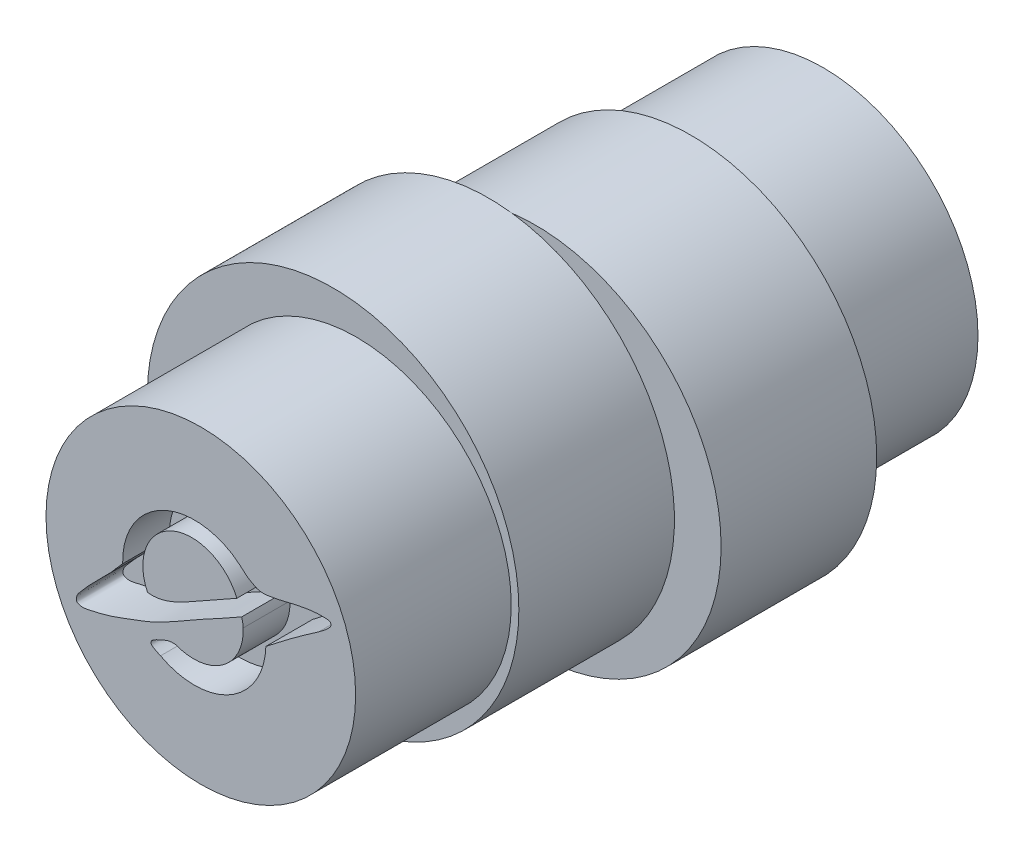
ISO-10303-21;
HEADER;
FILE_DESCRIPTION(('STEP AP214'),'2;1');
FILE_NAME('part.step','',(''),(''),'','','');
FILE_SCHEMA(('AUTOMOTIVE_DESIGN { 1 0 10303 214 1 1 1 1 }'));
ENDSEC;
DATA;
#1=APPLICATION_CONTEXT('core data for automotive mechanical design processes');
#2=APPLICATION_PROTOCOL_DEFINITION('international standard','automotive_design',2000,#1);
#3=PRODUCT_CONTEXT('',#1,'mechanical');
#4=PRODUCT('Part','Part','',(#3));
#5=PRODUCT_RELATED_PRODUCT_CATEGORY('part','',(#4));
#6=PRODUCT_DEFINITION_FORMATION('','',#4);
#7=PRODUCT_DEFINITION_CONTEXT('part definition',#1,'design');
#8=PRODUCT_DEFINITION('design','',#6,#7);
#9=PRODUCT_DEFINITION_SHAPE('','',#8);
#10=(LENGTH_UNIT() NAMED_UNIT(*) SI_UNIT(.MILLI.,.METRE.));
#11=(NAMED_UNIT(*) PLANE_ANGLE_UNIT() SI_UNIT($,.RADIAN.));
#12=(NAMED_UNIT(*) SI_UNIT($,.STERADIAN.) SOLID_ANGLE_UNIT());
#13=UNCERTAINTY_MEASURE_WITH_UNIT(LENGTH_MEASURE(1.E-05),#10,'distance_accuracy_value','');
#14=(GEOMETRIC_REPRESENTATION_CONTEXT(3) GLOBAL_UNCERTAINTY_ASSIGNED_CONTEXT((#13)) GLOBAL_UNIT_ASSIGNED_CONTEXT((#10,
#11,#12)) REPRESENTATION_CONTEXT('',''));
#15=CARTESIAN_POINT('',(0.,0.,0.));
#16=DIRECTION('',(0.,0.,1.));
#17=DIRECTION('',(1.,0.,0.));
#18=AXIS2_PLACEMENT_3D('',#15,#16,#17);
#19=CARTESIAN_POINT('',(2.12717647058824,1.57366968038905,26.1549480894362));
#20=DIRECTION('',(1.,0.,0.));
#21=DIRECTION('',(0.,0.,-1.));
#22=AXIS2_PLACEMENT_3D('',#19,#20,#21);
#23=PLANE('',#22);
#24=DIRECTION('',(0.,1.,0.));
#25=VECTOR('',#24,1.);
#26=CARTESIAN_POINT('',(2.12717647058824,1.57366968038905,13.0549480894362));
#27=LINE('',#26,#25);
#28=CARTESIAN_POINT('',(2.12717647058824,-1.57366968038905,13.0549480894362));
#29=VERTEX_POINT('',#28);
#30=CARTESIAN_POINT('',(2.12717647058824,1.57366968038905,13.0549480894362));
#31=VERTEX_POINT('',#30);
#32=EDGE_CURVE('E11',#29,#31,#27,.T.);
#33=ORIENTED_EDGE('',*,*,#32,.F.);
#34=DIRECTION('',(0.,0.,-1.));
#35=VECTOR('',#34,1.);
#36=CARTESIAN_POINT('',(2.12717647058824,-1.57366968038905,26.1549480894362));
#37=LINE('',#36,#35);
#38=CARTESIAN_POINT('',(2.12717647058824,-1.57366968038905,26.1549480894362));
#39=VERTEX_POINT('',#38);
#40=EDGE_CURVE('E355',#39,#29,#37,.T.);
#41=ORIENTED_EDGE('',*,*,#40,.F.);
#42=DIRECTION('',(0.,-1.,0.));
#43=VECTOR('',#42,1.);
#44=CARTESIAN_POINT('',(2.12717647058824,1.57366968038905,26.1549480894362));
#45=LINE('',#44,#43);
#46=CARTESIAN_POINT('',(2.12717647058824,1.57366968038905,26.1549480894362));
#47=VERTEX_POINT('',#46);
#48=EDGE_CURVE('E347',#47,#39,#45,.T.);
#49=ORIENTED_EDGE('',*,*,#48,.F.);
#50=DIRECTION('',(0.,0.,-1.));
#51=VECTOR('',#50,1.);
#52=CARTESIAN_POINT('',(2.12717647058824,1.57366968038905,26.1549480894362));
#53=LINE('',#52,#51);
#54=EDGE_CURVE('E351',#47,#31,#53,.T.);
#55=ORIENTED_EDGE('',*,*,#54,.T.);
#56=EDGE_LOOP('',(#33,#41,#49,#55));
#57=FACE_BOUND('',#56,.T.);
#58=ADVANCED_FACE('F45',(#57),#23,.F.);
#59=CARTESIAN_POINT('',(0.,0.,29.1263730350485));
#60=DIRECTION('',(0.,0.,-1.));
#61=DIRECTION('',(-1.,0.,0.));
#62=AXIS2_PLACEMENT_3D('',#59,#60,#61);
#63=CYLINDRICAL_SURFACE('',#62,4.975);
#64=CARTESIAN_POINT('',(0.,0.,10.0549480894362));
#65=DIRECTION('',(0.,0.,1.));
#66=DIRECTION('',(1.,0.,0.));
#67=AXIS2_PLACEMENT_3D('',#64,#65,#66);
#68=CIRCLE('',#67,4.975);
#69=CARTESIAN_POINT('',(4.975,0.,10.0549480894362));
#70=VERTEX_POINT('',#69);
#71=EDGE_CURVE('E383',#70,#70,#68,.T.);
#72=ORIENTED_EDGE('',*,*,#71,.T.);
#73=EDGE_LOOP('',(#72));
#74=FACE_BOUND('',#73,.T.);
#75=CARTESIAN_POINT('',(0.,0.,15.0549480894362));
#76=DIRECTION('',(0.,0.,1.));
#77=DIRECTION('',(1.,0.,0.));
#78=AXIS2_PLACEMENT_3D('',#75,#76,#77);
#79=CIRCLE('',#78,4.975);
#80=CARTESIAN_POINT('',(4.975,0.,15.0549480894362));
#81=VERTEX_POINT('',#80);
#82=EDGE_CURVE('E388',#81,#81,#79,.T.);
#83=ORIENTED_EDGE('',*,*,#82,.F.);
#84=EDGE_LOOP('',(#83));
#85=FACE_BOUND('',#84,.T.);
#86=ADVANCED_FACE('F47',(#74,#85),#63,.T.);
#87=CARTESIAN_POINT('',(0.,0.,10.0549480894362));
#88=DIRECTION('',(0.,0.,1.));
#89=DIRECTION('',(1.,0.,0.));
#90=AXIS2_PLACEMENT_3D('',#87,#88,#89);
#91=PLANE('',#90);
#92=CARTESIAN_POINT('',(0.,0.,10.0549480894362));
#93=DIRECTION('',(0.,0.,-1.));
#94=DIRECTION('',(-1.,0.,0.));
#95=AXIS2_PLACEMENT_3D('',#92,#93,#94);
#96=CIRCLE('',#95,2.646);
#97=CARTESIAN_POINT('',(-2.646,0.,10.0549480894362));
#98=VERTEX_POINT('',#97);
#99=EDGE_CURVE('E342',#98,#98,#96,.T.);
#100=ORIENTED_EDGE('',*,*,#99,.F.);
#101=EDGE_LOOP('',(#100));
#102=FACE_BOUND('',#101,.T.);
#103=ORIENTED_EDGE('',*,*,#71,.F.);
#104=EDGE_LOOP('',(#103));
#105=FACE_BOUND('',#104,.T.);
#106=ADVANCED_FACE('F397',(#102,#105),#91,.F.);
#107=CARTESIAN_POINT('',(0.75,0.,20.0549480894362));
#108=DIRECTION('',(0.,0.,1.));
#109=DIRECTION('',(1.,0.,0.));
#110=AXIS2_PLACEMENT_3D('',#107,#108,#109);
#111=PLANE('',#110);
#112=CARTESIAN_POINT('',(-0.75,0.,20.0549480894362));
#113=DIRECTION('',(0.,0.,1.));
#114=DIRECTION('',(1.,0.,0.));
#115=AXIS2_PLACEMENT_3D('',#112,#113,#114);
#116=CIRCLE('',#115,5.97);
#117=CARTESIAN_POINT('',(0.,-5.92270208604147,20.0549480894362));
#118=VERTEX_POINT('',#117);
#119=CARTESIAN_POINT('',(0.,5.92270208604147,20.0549480894362));
#120=VERTEX_POINT('',#119);
#121=EDGE_CURVE('E370',#118,#120,#116,.T.);
#122=ORIENTED_EDGE('',*,*,#121,.F.);
#123=CARTESIAN_POINT('',(0.75,0.,20.0549480894362));
#124=DIRECTION('',(0.,0.,1.));
#125=DIRECTION('',(1.,0.,0.));
#126=AXIS2_PLACEMENT_3D('',#123,#124,#125);
#127=CIRCLE('',#126,5.97);
#128=EDGE_CURVE('E384',#118,#120,#127,.T.);
#129=ORIENTED_EDGE('',*,*,#128,.T.);
#130=EDGE_LOOP('',(#122,#129));
#131=FACE_BOUND('',#130,.T.);
#132=ADVANCED_FACE('F399',(#131),#111,.T.);
#133=CARTESIAN_POINT('',(0.75,0.,15.0549480894362));
#134=DIRECTION('',(0.,0.,1.));
#135=DIRECTION('',(1.,0.,0.));
#136=AXIS2_PLACEMENT_3D('',#133,#134,#135);
#137=PLANE('',#136);
#138=ORIENTED_EDGE('',*,*,#82,.T.);
#139=EDGE_LOOP('',(#138));
#140=FACE_BOUND('',#139,.T.);
#141=CARTESIAN_POINT('',(0.75,0.,15.0549480894362));
#142=DIRECTION('',(0.,0.,1.));
#143=DIRECTION('',(1.,0.,0.));
#144=AXIS2_PLACEMENT_3D('',#141,#142,#143);
#145=CIRCLE('',#144,5.97);
#146=CARTESIAN_POINT('',(6.72,0.,15.0549480894362));
#147=VERTEX_POINT('',#146);
#148=EDGE_CURVE('E375',#147,#147,#145,.T.);
#149=ORIENTED_EDGE('',*,*,#148,.F.);
#150=EDGE_LOOP('',(#149));
#151=FACE_BOUND('',#150,.T.);
#152=ADVANCED_FACE('F406',(#140,#151),#137,.F.);
#153=CARTESIAN_POINT('',(0.75,0.,20.0549480894362));
#154=DIRECTION('',(0.,0.,-1.));
#155=DIRECTION('',(-1.,0.,0.));
#156=AXIS2_PLACEMENT_3D('',#153,#154,#155);
#157=CYLINDRICAL_SURFACE('',#156,5.97);
#158=EDGE_CURVE('E379',#120,#118,#127,.T.);
#159=ORIENTED_EDGE('',*,*,#158,.F.);
#160=ORIENTED_EDGE('',*,*,#128,.F.);
#161=EDGE_LOOP('',(#159,#160));
#162=FACE_BOUND('',#161,.T.);
#163=ORIENTED_EDGE('',*,*,#148,.T.);
#164=EDGE_LOOP('',(#163));
#165=FACE_BOUND('',#164,.T.);
#166=ADVANCED_FACE('F442',(#162,#165),#157,.T.);
#167=CARTESIAN_POINT('',(-0.75,0.,20.0549480894362));
#168=DIRECTION('',(0.,0.,1.));
#169=DIRECTION('',(1.,0.,0.));
#170=AXIS2_PLACEMENT_3D('',#167,#168,#169);
#171=PLANE('',#170);
#172=EDGE_CURVE('E366',#120,#118,#116,.T.);
#173=ORIENTED_EDGE('',*,*,#172,.F.);
#174=ORIENTED_EDGE('',*,*,#158,.T.);
#175=EDGE_LOOP('',(#173,#174));
#176=FACE_BOUND('',#175,.T.);
#177=ADVANCED_FACE('F438',(#176),#171,.F.);
#178=CARTESIAN_POINT('',(-0.75,0.,25.0549480894362));
#179=DIRECTION('',(0.,0.,1.));
#180=DIRECTION('',(1.,0.,0.));
#181=AXIS2_PLACEMENT_3D('',#178,#179,#180);
#182=PLANE('',#181);
#183=CARTESIAN_POINT('',(0.,0.,25.0549480894362));
#184=DIRECTION('',(0.,0.,1.));
#185=DIRECTION('',(1.,0.,0.));
#186=AXIS2_PLACEMENT_3D('',#183,#184,#185);
#187=CIRCLE('',#186,4.975);
#188=CARTESIAN_POINT('',(4.975,0.,25.0549480894362));
#189=VERTEX_POINT('',#188);
#190=EDGE_CURVE('E54',#189,#189,#187,.T.);
#191=ORIENTED_EDGE('',*,*,#190,.F.);
#192=EDGE_LOOP('',(#191));
#193=FACE_BOUND('',#192,.T.);
#194=CARTESIAN_POINT('',(-0.75,0.,25.0549480894362));
#195=DIRECTION('',(0.,0.,1.));
#196=DIRECTION('',(1.,0.,0.));
#197=AXIS2_PLACEMENT_3D('',#194,#195,#196);
#198=CIRCLE('',#197,5.97);
#199=CARTESIAN_POINT('',(5.22,0.,25.0549480894362));
#200=VERTEX_POINT('',#199);
#201=EDGE_CURVE('E371',#200,#200,#198,.T.);
#202=ORIENTED_EDGE('',*,*,#201,.T.);
#203=EDGE_LOOP('',(#202));
#204=FACE_BOUND('',#203,.T.);
#205=ADVANCED_FACE('F435',(#193,#204),#182,.T.);
#206=CARTESIAN_POINT('',(-0.75,0.,25.0549480894362));
#207=DIRECTION('',(0.,0.,-1.));
#208=DIRECTION('',(-1.,0.,0.));
#209=AXIS2_PLACEMENT_3D('',#206,#207,#208);
#210=CYLINDRICAL_SURFACE('',#209,5.97);
#211=ORIENTED_EDGE('',*,*,#201,.F.);
#212=EDGE_LOOP('',(#211));
#213=FACE_BOUND('',#212,.T.);
#214=ORIENTED_EDGE('',*,*,#172,.T.);
#215=ORIENTED_EDGE('',*,*,#121,.T.);
#216=EDGE_LOOP('',(#214,#215));
#217=FACE_BOUND('',#216,.T.);
#218=ADVANCED_FACE('F429',(#213,#217),#210,.T.);
#219=CARTESIAN_POINT('',(0.,0.,30.0549480894362));
#220=DIRECTION('',(0.,0.,1.));
#221=DIRECTION('',(1.,0.,0.));
#222=AXIS2_PLACEMENT_3D('',#219,#220,#221);
#223=PLANE('',#222);
#224=CARTESIAN_POINT('',(-2.51116552040536,-0.0879546361955797,30.0549480894362));
#225=CARTESIAN_POINT('',(-2.62882372726046,-0.204972871875267,30.0549480894362));
#226=CARTESIAN_POINT('',(-2.79409231360333,-0.437511253772377,30.0549480894362));
#227=CARTESIAN_POINT('',(-3.09159848005516,-0.713615898977803,30.0549480894362));
#228=CARTESIAN_POINT('',(-3.34138525492388,-0.98337291650734,30.0549480894362));
#229=CARTESIAN_POINT('',(-3.6095872502394,-1.23873960703839,30.0549480894362));
#230=CARTESIAN_POINT('',(-3.81917155134995,-1.4961109036613,30.0549480894362));
#231=CARTESIAN_POINT('',(-3.98791710518989,-1.67782917957464,30.0549480894362));
#232=CARTESIAN_POINT('',(-4.01764478757077,-1.89101855469726,30.0549480894362));
#233=CARTESIAN_POINT('',(-3.82192884913422,-1.96049600509836,30.0549480894362));
#234=CARTESIAN_POINT('',(-3.50206741243365,-1.89825042178683,30.0549480894362));
#235=CARTESIAN_POINT('',(-3.00328334748385,-1.78723227709745,30.0549480894362));
#236=CARTESIAN_POINT('',(-2.33784268529286,-1.5360650163923,30.0549480894362));
#237=CARTESIAN_POINT('',(-1.56832593467472,-1.26447100609586,30.0549480894362));
#238=CARTESIAN_POINT('',(-0.847852237869268,-0.872955403293095,30.0549480894362));
#239=CARTESIAN_POINT('',(-0.185861152675583,-0.47298163968003,30.0549480894362));
#240=CARTESIAN_POINT('',(0.484149510718239,-0.131008666699163,30.0549480894362));
#241=CARTESIAN_POINT('',(0.980555249996947,0.164223835121681,30.0549480894362));
#242=CARTESIAN_POINT('',(1.27139427387239,0.321666216706206,30.0549480894362));
#243=CARTESIAN_POINT('',(1.31188228878436,0.343336372221125,30.0549480894362));
#244=B_SPLINE_CURVE_WITH_KNOTS('',3,(#224,#225,#226,#227,#228,#229,#230,#231,#232,#233,#234,
#235,#236,#237,#238,#239,#240,#241,#242,#243),.UNSPECIFIED.,.F.,.F.,(4,1,1,1,1,1,1,1,1,1,1,1,1,
1,1,1,1,4),(0.239608580156058,0.285765007435693,0.318563148277103,0.35242979744223,
0.388146007445134,0.4217988871265,0.44407275187131,0.458807831120106,0.47033985471906,
0.493961983759507,0.550787640645854,0.611599975012957,0.692172205535716,0.777703006604457,
0.839356920843102,0.9076719843206,0.987176578789307,1.),.UNSPECIFIED.);
#245=CARTESIAN_POINT('',(-2.51116552040536,-0.0879546361955806,30.0549480894362));
#246=VERTEX_POINT('',#245);
#247=CARTESIAN_POINT('',(1.31188228878436,0.343336372221125,30.0549480894362));
#248=VERTEX_POINT('',#247);
#249=EDGE_CURVE('E61',#246,#248,#244,.T.);
#250=ORIENTED_EDGE('',*,*,#249,.F.);
#251=CARTESIAN_POINT('',(-0.202619098586472,-0.026420475480933,30.0549480894362));
#252=DIRECTION('',(0.,0.,1.));
#253=DIRECTION('',(-1.,0.,0.));
#254=AXIS2_PLACEMENT_3D('',#251,#252,#253);
#255=CIRCLE('',#254,2.30936637080989);
#256=CARTESIAN_POINT('',(1.00494425870241,1.94207229127257,30.0549480894362));
#257=VERTEX_POINT('',#256);
#258=EDGE_CURVE('E302',#257,#246,#255,.T.);
#259=ORIENTED_EDGE('',*,*,#258,.F.);
#260=CARTESIAN_POINT('',(1.5504772631421,1.51300656214162,30.0549480894362));
#261=CARTESIAN_POINT('',(1.47030803001561,1.55840600705102,30.0549480894362));
#262=CARTESIAN_POINT('',(1.37302131775991,1.65623440394904,30.0549480894362));
#263=CARTESIAN_POINT('',(1.197905149593,1.80802432640439,30.0549480894362));
#264=CARTESIAN_POINT('',(1.08055629874324,1.88628613900444,30.0549480894362));
#265=CARTESIAN_POINT('',(1.00494425870241,1.94207229127257,30.0549480894362));
#266=B_SPLINE_CURVE_WITH_KNOTS('',3,(#260,#261,#262,#263,#264,#265),.UNSPECIFIED.,.F.,.F.,(4,1,
1,4),(0.,0.392964355016922,0.593768783446463,1.),.UNSPECIFIED.);
#267=CARTESIAN_POINT('',(1.5504772631421,1.51300656214162,30.0549480894362));
#268=VERTEX_POINT('',#267);
#269=EDGE_CURVE('E293',#268,#257,#266,.T.);
#270=ORIENTED_EDGE('',*,*,#269,.F.);
#271=CARTESIAN_POINT('',(3.79226200632866,1.16808119197923,30.0549480894362));
#272=CARTESIAN_POINT('',(3.96826518209726,1.29115417457461,30.0549480894362));
#273=CARTESIAN_POINT('',(4.01042970572263,1.33590231808948,30.0549480894362));
#274=CARTESIAN_POINT('',(4.12631867063342,1.44725910982723,30.0549480894362));
#275=CARTESIAN_POINT('',(4.20238127202434,1.52843867026858,30.0549480894362));
#276=CARTESIAN_POINT('',(4.16894147480952,1.64406265825557,30.0549480894362));
#277=CARTESIAN_POINT('',(3.96977633426687,1.65966105274172,30.0549480894362));
#278=CARTESIAN_POINT('',(3.78401922130073,1.6573877970879,30.0549480894362));
#279=CARTESIAN_POINT('',(3.52376734766728,1.63957040919138,30.0549480894362));
#280=CARTESIAN_POINT('',(3.2790255679294,1.59186516370776,30.0549480894362));
#281=CARTESIAN_POINT('',(2.98224163667397,1.54113748259657,30.0549480894362));
#282=CARTESIAN_POINT('',(2.66672310968338,1.44675180322472,30.0549480894362));
#283=CARTESIAN_POINT('',(2.33188218747009,1.38813166324327,30.0549480894362));
#284=CARTESIAN_POINT('',(2.039141531163,1.33435669267709,30.0549480894362));
#285=CARTESIAN_POINT('',(1.77301084307797,1.36627345927699,30.0549480894362));
#286=CARTESIAN_POINT('',(1.63586477435799,1.47423998660522,30.0549480894362));
#287=CARTESIAN_POINT('',(1.5504772631421,1.51300656214162,30.0549480894362));
#288=B_SPLINE_CURVE_WITH_KNOTS('',3,(#271,#272,#273,#274,#275,#276,#277,#278,#279,#280,#281,
#282,#283,#284,#285,#286,#287),.UNSPECIFIED.,.F.,.F.,(4,1,1,1,1,1,1,1,1,1,1,1,1,1,4),(0.,
0.0934254171940325,0.108002146589678,0.145767293956456,0.182463835466747,0.223658494134976,
0.303937919566909,0.364325360724311,0.459756351060404,0.533634950398501,0.640349585723799,
0.761539514920497,0.845551801538903,0.913246104318703,1.),.UNSPECIFIED.);
#289=CARTESIAN_POINT('',(3.79226200632866,1.16808119197923,30.0549480894362));
#290=VERTEX_POINT('',#289);
#291=EDGE_CURVE('E284',#290,#268,#288,.T.);
#292=ORIENTED_EDGE('',*,*,#291,.F.);
#293=CARTESIAN_POINT('',(2.09135442809297,-0.0879546361955797,30.0549480894362));
#294=CARTESIAN_POINT('',(2.92614779337667,0.575225687021486,30.0549480894362));
#295=CARTESIAN_POINT('',(3.79226200632867,1.16808119197923,30.0549480894362));
#296=B_SPLINE_CURVE_WITH_KNOTS('',2,(#293,#294,#295),.UNSPECIFIED.,.F.,.F.,(3,3),(0.,1.),.UNSPECIFIED.);
#297=CARTESIAN_POINT('',(2.09135442809297,-0.0879546361955797,30.0549480894362));
#298=VERTEX_POINT('',#297);
#299=EDGE_CURVE('E278',#298,#290,#296,.T.);
#300=ORIENTED_EDGE('',*,*,#299,.F.);
#301=CARTESIAN_POINT('',(-0.206218635925538,-0.0184281934084253,30.0549480894362));
#302=DIRECTION('',(0.,0.,1.));
#303=DIRECTION('',(-1.,0.,0.));
#304=AXIS2_PLACEMENT_3D('',#301,#302,#303);
#305=CIRCLE('',#304,2.29862478685627);
#306=CARTESIAN_POINT('',(-1.29479350224635,-2.04294805529288,30.0549480894362));
#307=VERTEX_POINT('',#306);
#308=EDGE_CURVE('E271',#307,#298,#305,.T.);
#309=ORIENTED_EDGE('',*,*,#308,.F.);
#310=CARTESIAN_POINT('',(-1.11751756231805,-1.5232736528193,30.0549480894362));
#311=CARTESIAN_POINT('',(-1.71170377511869,-1.76261312302672,30.0549480894362));
#312=CARTESIAN_POINT('',(-1.74690979560648,-1.84867271061177,30.0549480894362));
#313=CARTESIAN_POINT('',(-1.29479350224635,-2.04294805529288,30.0549480894362));
#314=B_SPLINE_CURVE_WITH_KNOTS('',3,(#310,#311,#312,#313),.UNSPECIFIED.,.F.,.F.,(4,4),(0.,1.),.UNSPECIFIED.);
#315=CARTESIAN_POINT('',(-1.11751756231805,-1.5232736528193,30.0549480894362));
#316=VERTEX_POINT('',#315);
#317=EDGE_CURVE('E262',#316,#307,#314,.T.);
#318=ORIENTED_EDGE('',*,*,#317,.F.);
#319=CARTESIAN_POINT('',(-0.637638887355288,-1.54271427727108,30.0549480894362));
#320=CARTESIAN_POINT('',(-0.851635042291199,-1.43376008591793,30.0549480894362));
#321=CARTESIAN_POINT('',(-1.11751756231805,-1.5232736528193,30.0549480894362));
#322=B_SPLINE_CURVE_WITH_KNOTS('',2,(#319,#320,#321),.UNSPECIFIED.,.F.,.F.,(3,3),(0.,1.),.UNSPECIFIED.);
#323=CARTESIAN_POINT('',(-0.637638887355288,-1.54271427727108,30.0549480894362));
#324=VERTEX_POINT('',#323);
#325=EDGE_CURVE('E256',#324,#316,#322,.T.);
#326=ORIENTED_EDGE('',*,*,#325,.F.);
#327=CARTESIAN_POINT('',(-0.226470917504727,-0.00647477574069601,30.0549480894362));
#328=DIRECTION('',(0.,0.,-1.));
#329=DIRECTION('',(-1.,0.,0.));
#330=AXIS2_PLACEMENT_3D('',#327,#328,#329);
#331=CIRCLE('',#330,1.59031157497308);
#332=CARTESIAN_POINT('',(1.36240426555996,0.0611015376723629,30.0549480894362));
#333=VERTEX_POINT('',#332);
#334=EDGE_CURVE('E249',#333,#324,#331,.T.);
#335=ORIENTED_EDGE('',*,*,#334,.F.);
#336=CARTESIAN_POINT('',(1.31188228878436,0.343336372221125,30.0549480894362));
#337=CARTESIAN_POINT('',(1.35501938836087,0.205736583092832,30.0549480894362));
#338=CARTESIAN_POINT('',(1.36240426555996,0.0611015376723632,30.0549480894362));
#339=B_SPLINE_CURVE_WITH_KNOTS('',2,(#336,#337,#338),.UNSPECIFIED.,.F.,.F.,(3,3),(0.,1.),.UNSPECIFIED.);
#340=EDGE_CURVE('E240',#248,#333,#339,.T.);
#341=ORIENTED_EDGE('',*,*,#340,.F.);
#342=EDGE_LOOP('',(#250,#259,#270,#292,#300,#309,#318,#326,#335,#341));
#343=FACE_BOUND('',#342,.T.);
#344=CARTESIAN_POINT('',(0.,0.,30.0549480894362));
#345=DIRECTION('',(0.,0.,1.));
#346=DIRECTION('',(1.,0.,0.));
#347=AXIS2_PLACEMENT_3D('',#344,#345,#346);
#348=CIRCLE('',#347,4.975);
#349=CARTESIAN_POINT('',(4.975,0.,30.0549480894362));
#350=VERTEX_POINT('',#349);
#351=EDGE_CURVE('E359',#350,#350,#348,.T.);
#352=ORIENTED_EDGE('',*,*,#351,.T.);
#353=EDGE_LOOP('',(#352));
#354=FACE_BOUND('',#353,.T.);
#355=ADVANCED_FACE('F426',(#343,#354),#223,.T.);
#356=CARTESIAN_POINT('',(0.,0.,30.0549480894362));
#357=DIRECTION('',(0.,0.,-1.));
#358=DIRECTION('',(-1.,0.,0.));
#359=AXIS2_PLACEMENT_3D('',#356,#357,#358);
#360=CYLINDRICAL_SURFACE('',#359,4.975);
#361=ORIENTED_EDGE('',*,*,#351,.F.);
#362=EDGE_LOOP('',(#361));
#363=FACE_BOUND('',#362,.T.);
#364=ORIENTED_EDGE('',*,*,#190,.T.);
#365=EDGE_LOOP('',(#364));
#366=FACE_BOUND('',#365,.T.);
#367=ADVANCED_FACE('F424',(#363,#366),#360,.T.);
#368=CARTESIAN_POINT('',(0.,0.,26.1549480894362));
#369=DIRECTION('',(0.,0.,-1.));
#370=DIRECTION('',(-1.,0.,0.));
#371=AXIS2_PLACEMENT_3D('',#368,#369,#370);
#372=CYLINDRICAL_SURFACE('',#371,2.646);
#373=ORIENTED_EDGE('',*,*,#99,.T.);
#374=EDGE_LOOP('',(#373));
#375=FACE_BOUND('',#374,.T.);
#376=CARTESIAN_POINT('',(0.,0.,13.0549480894362));
#377=DIRECTION('',(0.,0.,-1.));
#378=DIRECTION('',(-1.,0.,0.));
#379=AXIS2_PLACEMENT_3D('',#376,#377,#378);
#380=CIRCLE('',#379,2.646);
#381=EDGE_CURVE('E313',#31,#29,#380,.T.);
#382=ORIENTED_EDGE('',*,*,#381,.F.);
#383=ORIENTED_EDGE('',*,*,#54,.F.);
#384=CARTESIAN_POINT('',(0.,0.,26.1549480894362));
#385=DIRECTION('',(0.,0.,-1.));
#386=DIRECTION('',(-1.,0.,0.));
#387=AXIS2_PLACEMENT_3D('',#384,#385,#386);
#388=CIRCLE('',#387,2.646);
#389=EDGE_CURVE('E343',#39,#47,#388,.T.);
#390=ORIENTED_EDGE('',*,*,#389,.F.);
#391=ORIENTED_EDGE('',*,*,#40,.T.);
#392=EDGE_LOOP('',(#382,#383,#390,#391));
#393=FACE_BOUND('',#392,.T.);
#394=ADVANCED_FACE('F422',(#375,#393),#372,.F.);
#395=CARTESIAN_POINT('',(0.,0.,26.1549480894362));
#396=DIRECTION('',(0.,0.,-1.));
#397=DIRECTION('',(-1.,0.,0.));
#398=AXIS2_PLACEMENT_3D('',#395,#396,#397);
#399=PLANE('',#398);
#400=ORIENTED_EDGE('',*,*,#389,.T.);
#401=ORIENTED_EDGE('',*,*,#48,.T.);
#402=EDGE_LOOP('',(#400,#401));
#403=FACE_BOUND('',#402,.T.);
#404=ADVANCED_FACE('F420',(#403),#399,.T.);
#405=CARTESIAN_POINT('',(0.,0.,13.0549480894362));
#406=DIRECTION('',(0.,0.,-1.));
#407=DIRECTION('',(-1.,0.,0.));
#408=AXIS2_PLACEMENT_3D('',#405,#406,#407);
#409=PLANE('',#408);
#410=ORIENTED_EDGE('',*,*,#32,.T.);
#411=ORIENTED_EDGE('',*,*,#381,.T.);
#412=EDGE_LOOP('',(#410,#411));
#413=FACE_BOUND('',#412,.T.);
#414=ADVANCED_FACE('F536',(#413),#409,.T.);
#415=CARTESIAN_POINT('',(-2.51116552040536,-0.0879546361955797,28.5549480894362));
#416=CARTESIAN_POINT('',(-2.62882372726046,-0.204972871875267,28.5549480894362));
#417=CARTESIAN_POINT('',(-2.79409231360333,-0.437511253772377,28.5549480894362));
#418=CARTESIAN_POINT('',(-3.09159848005516,-0.713615898977803,28.5549480894362));
#419=CARTESIAN_POINT('',(-3.34138525492388,-0.98337291650734,28.5549480894362));
#420=CARTESIAN_POINT('',(-3.6095872502394,-1.23873960703839,28.5549480894362));
#421=CARTESIAN_POINT('',(-3.81917155134995,-1.4961109036613,28.5549480894362));
#422=CARTESIAN_POINT('',(-3.98791710518989,-1.67782917957464,28.5549480894362));
#423=CARTESIAN_POINT('',(-4.01764478757077,-1.89101855469726,28.5549480894362));
#424=CARTESIAN_POINT('',(-3.82192884913422,-1.96049600509836,28.5549480894362));
#425=CARTESIAN_POINT('',(-3.50206741243365,-1.89825042178683,28.5549480894362));
#426=CARTESIAN_POINT('',(-3.00328334748385,-1.78723227709745,28.5549480894362));
#427=CARTESIAN_POINT('',(-2.33784268529286,-1.5360650163923,28.5549480894362));
#428=CARTESIAN_POINT('',(-1.56832593467472,-1.26447100609586,28.5549480894362));
#429=CARTESIAN_POINT('',(-0.847852237869268,-0.872955403293095,28.5549480894362));
#430=CARTESIAN_POINT('',(-0.185861152675583,-0.47298163968003,28.5549480894362));
#431=CARTESIAN_POINT('',(0.484149510718239,-0.131008666699163,28.5549480894362));
#432=CARTESIAN_POINT('',(0.980555249996947,0.164223835121681,28.5549480894362));
#433=CARTESIAN_POINT('',(1.27139427387239,0.321666216706206,28.5549480894362));
#434=CARTESIAN_POINT('',(1.31188228878436,0.343336372221125,28.5549480894362));
#435=B_SPLINE_CURVE_WITH_KNOTS('',3,(#415,#416,#417,#418,#419,#420,#421,#422,#423,#424,#425,
#426,#427,#428,#429,#430,#431,#432,#433,#434),.UNSPECIFIED.,.F.,.F.,(4,1,1,1,1,1,1,1,1,1,1,1,1,
1,1,1,1,4),(0.239608580156058,0.285765007435693,0.318563148277103,0.35242979744223,
0.388146007445134,0.4217988871265,0.44407275187131,0.458807831120106,0.47033985471906,
0.493961983759507,0.550787640645854,0.611599975012957,0.692172205535716,0.777703006604457,
0.839356920843102,0.9076719843206,0.987176578789307,1.),.UNSPECIFIED.);
#436=DIRECTION('',(0.,0.,1.));
#437=VECTOR('',#436,1.);
#438=SURFACE_OF_LINEAR_EXTRUSION('',#435,#437);
#439=ORIENTED_EDGE('',*,*,#249,.T.);
#440=DIRECTION('',(0.,0.,1.));
#441=VECTOR('',#440,1.);
#442=CARTESIAN_POINT('',(1.31188228878436,0.343336372221125,28.5549480894362));
#443=LINE('',#442,#441);
#444=CARTESIAN_POINT('',(1.31188228878436,0.343336372221125,28.5549480894362));
#445=VERTEX_POINT('',#444);
#446=EDGE_CURVE('E235',#445,#248,#443,.T.);
#447=ORIENTED_EDGE('',*,*,#446,.F.);
#448=CARTESIAN_POINT('',(-2.51116552040536,-0.0879546361955806,28.5549480894362));
#449=VERTEX_POINT('',#448);
#450=EDGE_CURVE('E309',#449,#445,#435,.T.);
#451=ORIENTED_EDGE('',*,*,#450,.F.);
#452=DIRECTION('',(0.,0.,1.));
#453=VECTOR('',#452,1.);
#454=CARTESIAN_POINT('',(-2.51116552040536,-0.0879546361955806,28.5549480894362));
#455=LINE('',#454,#453);
#456=EDGE_CURVE('E310',#449,#246,#455,.T.);
#457=ORIENTED_EDGE('',*,*,#456,.T.);
#458=EDGE_LOOP('',(#439,#447,#451,#457));
#459=FACE_BOUND('',#458,.T.);
#460=ADVANCED_FACE('F207',(#459),#438,.F.);
#461=CARTESIAN_POINT('',(-0.202619098586472,-0.026420475480933,28.5549480894362));
#462=DIRECTION('',(0.,0.,1.));
#463=DIRECTION('',(1.,0.,0.));
#464=AXIS2_PLACEMENT_3D('',#461,#462,#463);
#465=CYLINDRICAL_SURFACE('',#464,2.30936637080989);
#466=ORIENTED_EDGE('',*,*,#258,.T.);
#467=ORIENTED_EDGE('',*,*,#456,.F.);
#468=CARTESIAN_POINT('',(-0.202619098586472,-0.026420475480933,28.5549480894362));
#469=DIRECTION('',(0.,0.,1.));
#470=DIRECTION('',(-1.,0.,0.));
#471=AXIS2_PLACEMENT_3D('',#468,#469,#470);
#472=CIRCLE('',#471,2.30936637080989);
#473=CARTESIAN_POINT('',(1.00494425870241,1.94207229127257,28.5549480894362));
#474=VERTEX_POINT('',#473);
#475=EDGE_CURVE('E223',#474,#449,#472,.T.);
#476=ORIENTED_EDGE('',*,*,#475,.F.);
#477=DIRECTION('',(0.,0.,1.));
#478=VECTOR('',#477,1.);
#479=CARTESIAN_POINT('',(1.00494425870241,1.94207229127257,28.5549480894362));
#480=LINE('',#479,#478);
#481=EDGE_CURVE('E314',#474,#257,#480,.T.);
#482=ORIENTED_EDGE('',*,*,#481,.T.);
#483=EDGE_LOOP('',(#466,#467,#476,#482));
#484=FACE_BOUND('',#483,.T.);
#485=ADVANCED_FACE('F203',(#484),#465,.F.);
#486=CARTESIAN_POINT('',(1.5504772631421,1.51300656214162,28.5549480894362));
#487=CARTESIAN_POINT('',(1.47030803001561,1.55840600705102,28.5549480894362));
#488=CARTESIAN_POINT('',(1.37302131775991,1.65623440394904,28.5549480894362));
#489=CARTESIAN_POINT('',(1.197905149593,1.80802432640439,28.5549480894362));
#490=CARTESIAN_POINT('',(1.08055629874324,1.88628613900444,28.5549480894362));
#491=CARTESIAN_POINT('',(1.00494425870241,1.94207229127257,28.5549480894362));
#492=B_SPLINE_CURVE_WITH_KNOTS('',3,(#486,#487,#488,#489,#490,#491),.UNSPECIFIED.,.F.,.F.,(4,1,
1,4),(0.,0.392964355016922,0.593768783446463,1.),.UNSPECIFIED.);
#493=DIRECTION('',(0.,0.,1.));
#494=VECTOR('',#493,1.);
#495=SURFACE_OF_LINEAR_EXTRUSION('',#492,#494);
#496=ORIENTED_EDGE('',*,*,#269,.T.);
#497=ORIENTED_EDGE('',*,*,#481,.F.);
#498=CARTESIAN_POINT('',(1.5504772631421,1.51300656214162,28.5549480894362));
#499=VERTEX_POINT('',#498);
#500=EDGE_CURVE('E216',#499,#474,#492,.T.);
#501=ORIENTED_EDGE('',*,*,#500,.F.);
#502=DIRECTION('',(0.,0.,1.));
#503=VECTOR('',#502,1.);
#504=CARTESIAN_POINT('',(1.5504772631421,1.51300656214162,28.5549480894362));
#505=LINE('',#504,#503);
#506=EDGE_CURVE('E317',#499,#268,#505,.T.);
#507=ORIENTED_EDGE('',*,*,#506,.T.);
#508=EDGE_LOOP('',(#496,#497,#501,#507));
#509=FACE_BOUND('',#508,.T.);
#510=ADVANCED_FACE('F206',(#509),#495,.F.);
#511=CARTESIAN_POINT('',(3.79226200632866,1.16808119197923,28.5549480894362));
#512=CARTESIAN_POINT('',(3.96826518209726,1.29115417457461,28.5549480894362));
#513=CARTESIAN_POINT('',(4.01042970572263,1.33590231808948,28.5549480894362));
#514=CARTESIAN_POINT('',(4.12631867063342,1.44725910982723,28.5549480894362));
#515=CARTESIAN_POINT('',(4.20238127202434,1.52843867026858,28.5549480894362));
#516=CARTESIAN_POINT('',(4.16894147480952,1.64406265825557,28.5549480894362));
#517=CARTESIAN_POINT('',(3.96977633426687,1.65966105274172,28.5549480894362));
#518=CARTESIAN_POINT('',(3.78401922130073,1.6573877970879,28.5549480894362));
#519=CARTESIAN_POINT('',(3.52376734766728,1.63957040919138,28.5549480894362));
#520=CARTESIAN_POINT('',(3.2790255679294,1.59186516370776,28.5549480894362));
#521=CARTESIAN_POINT('',(2.98224163667397,1.54113748259657,28.5549480894362));
#522=CARTESIAN_POINT('',(2.66672310968338,1.44675180322472,28.5549480894362));
#523=CARTESIAN_POINT('',(2.33188218747009,1.38813166324327,28.5549480894362));
#524=CARTESIAN_POINT('',(2.039141531163,1.33435669267709,28.5549480894362));
#525=CARTESIAN_POINT('',(1.77301084307797,1.36627345927699,28.5549480894362));
#526=CARTESIAN_POINT('',(1.63586477435799,1.47423998660522,28.5549480894362));
#527=CARTESIAN_POINT('',(1.5504772631421,1.51300656214162,28.5549480894362));
#528=B_SPLINE_CURVE_WITH_KNOTS('',3,(#511,#512,#513,#514,#515,#516,#517,#518,#519,#520,#521,
#522,#523,#524,#525,#526,#527),.UNSPECIFIED.,.F.,.F.,(4,1,1,1,1,1,1,1,1,1,1,1,1,1,4),(0.,
0.0934254171940325,0.108002146589678,0.145767293956456,0.182463835466747,0.223658494134976,
0.303937919566909,0.364325360724311,0.459756351060404,0.533634950398501,0.640349585723799,
0.761539514920497,0.845551801538903,0.913246104318703,1.),.UNSPECIFIED.);
#529=DIRECTION('',(0.,0.,1.));
#530=VECTOR('',#529,1.);
#531=SURFACE_OF_LINEAR_EXTRUSION('',#528,#530);
#532=ORIENTED_EDGE('',*,*,#291,.T.);
#533=ORIENTED_EDGE('',*,*,#506,.F.);
#534=CARTESIAN_POINT('',(3.79226200632866,1.16808119197923,28.5549480894362));
#535=VERTEX_POINT('',#534);
#536=EDGE_CURVE('E224',#535,#499,#528,.T.);
#537=ORIENTED_EDGE('',*,*,#536,.F.);
#538=DIRECTION('',(0.,0.,1.));
#539=VECTOR('',#538,1.);
#540=CARTESIAN_POINT('',(3.79226200632866,1.16808119197923,28.5549480894362));
#541=LINE('',#540,#539);
#542=EDGE_CURVE('E320',#535,#290,#541,.T.);
#543=ORIENTED_EDGE('',*,*,#542,.T.);
#544=EDGE_LOOP('',(#532,#533,#537,#543));
#545=FACE_BOUND('',#544,.T.);
#546=ADVANCED_FACE('F212',(#545),#531,.F.);
#547=CARTESIAN_POINT('',(2.09135442809297,-0.0879546361955797,28.5549480894362));
#548=CARTESIAN_POINT('',(2.92614779337667,0.575225687021486,28.5549480894362));
#549=CARTESIAN_POINT('',(3.79226200632867,1.16808119197923,28.5549480894362));
#550=B_SPLINE_CURVE_WITH_KNOTS('',2,(#547,#548,#549),.UNSPECIFIED.,.F.,.F.,(3,3),(0.,1.),.UNSPECIFIED.);
#551=DIRECTION('',(0.,0.,1.));
#552=VECTOR('',#551,1.);
#553=SURFACE_OF_LINEAR_EXTRUSION('',#550,#552);
#554=ORIENTED_EDGE('',*,*,#299,.T.);
#555=ORIENTED_EDGE('',*,*,#542,.F.);
#556=CARTESIAN_POINT('',(2.09135442809297,-0.0879546361955797,28.5549480894362));
#557=VERTEX_POINT('',#556);
#558=EDGE_CURVE('E466',#557,#535,#550,.T.);
#559=ORIENTED_EDGE('',*,*,#558,.F.);
#560=DIRECTION('',(0.,0.,1.));
#561=VECTOR('',#560,1.);
#562=CARTESIAN_POINT('',(2.09135442809297,-0.0879546361955797,28.5549480894362));
#563=LINE('',#562,#561);
#564=EDGE_CURVE('E323',#557,#298,#563,.T.);
#565=ORIENTED_EDGE('',*,*,#564,.T.);
#566=EDGE_LOOP('',(#554,#555,#559,#565));
#567=FACE_BOUND('',#566,.T.);
#568=ADVANCED_FACE('F648',(#567),#553,.F.);
#569=CARTESIAN_POINT('',(-0.206218635925538,-0.0184281934084253,28.5549480894362));
#570=DIRECTION('',(0.,0.,1.));
#571=DIRECTION('',(1.,0.,0.));
#572=AXIS2_PLACEMENT_3D('',#569,#570,#571);
#573=CYLINDRICAL_SURFACE('',#572,2.29862478685627);
#574=ORIENTED_EDGE('',*,*,#308,.T.);
#575=ORIENTED_EDGE('',*,*,#564,.F.);
#576=CARTESIAN_POINT('',(-0.206218635925538,-0.0184281934084253,28.5549480894362));
#577=DIRECTION('',(0.,0.,1.));
#578=DIRECTION('',(-1.,0.,0.));
#579=AXIS2_PLACEMENT_3D('',#576,#577,#578);
#580=CIRCLE('',#579,2.29862478685627);
#581=CARTESIAN_POINT('',(-1.29479350224635,-2.04294805529288,28.5549480894362));
#582=VERTEX_POINT('',#581);
#583=EDGE_CURVE('E469',#582,#557,#580,.T.);
#584=ORIENTED_EDGE('',*,*,#583,.F.);
#585=DIRECTION('',(0.,0.,1.));
#586=VECTOR('',#585,1.);
#587=CARTESIAN_POINT('',(-1.29479350224635,-2.04294805529288,28.5549480894362));
#588=LINE('',#587,#586);
#589=EDGE_CURVE('E326',#582,#307,#588,.T.);
#590=ORIENTED_EDGE('',*,*,#589,.T.);
#591=EDGE_LOOP('',(#574,#575,#584,#590));
#592=FACE_BOUND('',#591,.T.);
#593=ADVANCED_FACE('F656',(#592),#573,.F.);
#594=CARTESIAN_POINT('',(-1.11751756231805,-1.5232736528193,28.5549480894362));
#595=CARTESIAN_POINT('',(-1.71170377511869,-1.76261312302672,28.5549480894362));
#596=CARTESIAN_POINT('',(-1.74690979560648,-1.84867271061177,28.5549480894362));
#597=CARTESIAN_POINT('',(-1.29479350224635,-2.04294805529288,28.5549480894362));
#598=B_SPLINE_CURVE_WITH_KNOTS('',3,(#594,#595,#596,#597),.UNSPECIFIED.,.F.,.F.,(4,4),(0.,1.),.UNSPECIFIED.);
#599=DIRECTION('',(0.,0.,1.));
#600=VECTOR('',#599,1.);
#601=SURFACE_OF_LINEAR_EXTRUSION('',#598,#600);
#602=ORIENTED_EDGE('',*,*,#317,.T.);
#603=ORIENTED_EDGE('',*,*,#589,.F.);
#604=CARTESIAN_POINT('',(-1.11751756231805,-1.5232736528193,28.5549480894362));
#605=VERTEX_POINT('',#604);
#606=EDGE_CURVE('E472',#605,#582,#598,.T.);
#607=ORIENTED_EDGE('',*,*,#606,.F.);
#608=DIRECTION('',(0.,0.,1.));
#609=VECTOR('',#608,1.);
#610=CARTESIAN_POINT('',(-1.11751756231805,-1.5232736528193,28.5549480894362));
#611=LINE('',#610,#609);
#612=EDGE_CURVE('E329',#605,#316,#611,.T.);
#613=ORIENTED_EDGE('',*,*,#612,.T.);
#614=EDGE_LOOP('',(#602,#603,#607,#613));
#615=FACE_BOUND('',#614,.T.);
#616=ADVANCED_FACE('F664',(#615),#601,.F.);
#617=CARTESIAN_POINT('',(-0.637638887355288,-1.54271427727108,28.5549480894362));
#618=CARTESIAN_POINT('',(-0.851635042291199,-1.43376008591793,28.5549480894362));
#619=CARTESIAN_POINT('',(-1.11751756231805,-1.5232736528193,28.5549480894362));
#620=B_SPLINE_CURVE_WITH_KNOTS('',2,(#617,#618,#619),.UNSPECIFIED.,.F.,.F.,(3,3),(0.,1.),.UNSPECIFIED.);
#621=DIRECTION('',(0.,0.,1.));
#622=VECTOR('',#621,1.);
#623=SURFACE_OF_LINEAR_EXTRUSION('',#620,#622);
#624=ORIENTED_EDGE('',*,*,#325,.T.);
#625=ORIENTED_EDGE('',*,*,#612,.F.);
#626=CARTESIAN_POINT('',(-0.637638887355288,-1.54271427727108,28.5549480894362));
#627=VERTEX_POINT('',#626);
#628=EDGE_CURVE('E476',#627,#605,#620,.T.);
#629=ORIENTED_EDGE('',*,*,#628,.F.);
#630=DIRECTION('',(0.,0.,1.));
#631=VECTOR('',#630,1.);
#632=CARTESIAN_POINT('',(-0.637638887355288,-1.54271427727108,28.5549480894362));
#633=LINE('',#632,#631);
#634=EDGE_CURVE('E332',#627,#324,#633,.T.);
#635=ORIENTED_EDGE('',*,*,#634,.T.);
#636=EDGE_LOOP('',(#624,#625,#629,#635));
#637=FACE_BOUND('',#636,.T.);
#638=ADVANCED_FACE('F673',(#637),#623,.F.);
#639=CARTESIAN_POINT('',(-0.226470917504727,-0.00647477574069601,28.5549480894362));
#640=DIRECTION('',(0.,0.,1.));
#641=DIRECTION('',(1.,0.,0.));
#642=AXIS2_PLACEMENT_3D('',#639,#640,#641);
#643=CYLINDRICAL_SURFACE('',#642,1.59031157497308);
#644=ORIENTED_EDGE('',*,*,#334,.T.);
#645=ORIENTED_EDGE('',*,*,#634,.F.);
#646=CARTESIAN_POINT('',(-0.226470917504727,-0.00647477574069601,28.5549480894362));
#647=DIRECTION('',(0.,0.,-1.));
#648=DIRECTION('',(-1.,0.,0.));
#649=AXIS2_PLACEMENT_3D('',#646,#647,#648);
#650=CIRCLE('',#649,1.59031157497308);
#651=CARTESIAN_POINT('',(1.36240426555996,0.0611015376723629,28.5549480894362));
#652=VERTEX_POINT('',#651);
#653=EDGE_CURVE('E480',#652,#627,#650,.T.);
#654=ORIENTED_EDGE('',*,*,#653,.F.);
#655=DIRECTION('',(0.,0.,1.));
#656=VECTOR('',#655,1.);
#657=CARTESIAN_POINT('',(1.36240426555996,0.0611015376723629,28.5549480894362));
#658=LINE('',#657,#656);
#659=EDGE_CURVE('E335',#652,#333,#658,.T.);
#660=ORIENTED_EDGE('',*,*,#659,.T.);
#661=EDGE_LOOP('',(#644,#645,#654,#660));
#662=FACE_BOUND('',#661,.T.);
#663=ADVANCED_FACE('F682',(#662),#643,.T.);
#664=CARTESIAN_POINT('',(1.31188228878436,0.343336372221125,28.5549480894362));
#665=CARTESIAN_POINT('',(1.35501938836087,0.205736583092832,28.5549480894362));
#666=CARTESIAN_POINT('',(1.36240426555996,0.0611015376723632,28.5549480894362));
#667=B_SPLINE_CURVE_WITH_KNOTS('',2,(#664,#665,#666),.UNSPECIFIED.,.F.,.F.,(3,3),(0.,1.),.UNSPECIFIED.);
#668=DIRECTION('',(0.,0.,1.));
#669=VECTOR('',#668,1.);
#670=SURFACE_OF_LINEAR_EXTRUSION('',#667,#669);
#671=ORIENTED_EDGE('',*,*,#340,.T.);
#672=ORIENTED_EDGE('',*,*,#659,.F.);
#673=EDGE_CURVE('E484',#445,#652,#667,.T.);
#674=ORIENTED_EDGE('',*,*,#673,.F.);
#675=ORIENTED_EDGE('',*,*,#446,.T.);
#676=EDGE_LOOP('',(#671,#672,#674,#675));
#677=FACE_BOUND('',#676,.T.);
#678=ADVANCED_FACE('F202',(#677),#670,.F.);
#679=CARTESIAN_POINT('',(-2.3202645861231,-1.53257310042932,28.5549480894362));
#680=DIRECTION('',(0.,0.,-1.));
#681=DIRECTION('',(-1.,0.,0.));
#682=AXIS2_PLACEMENT_3D('',#679,#680,#681);
#683=PLANE('',#682);
#684=CARTESIAN_POINT('',(-0.517874244679449,-0.158916370387108,28.5549480894362));
#685=CARTESIAN_POINT('',(0.320919336544083,0.310316940814639,28.5549480894362));
#686=CARTESIAN_POINT('',(1.15739564419464,0.783657031326622,28.5549480894362));
#687=B_SPLINE_CURVE_WITH_KNOTS('',2,(#684,#685,#686),.UNSPECIFIED.,.F.,.F.,(3,3),(0.,1.),.UNSPECIFIED.);
#688=CARTESIAN_POINT('',(-0.517874244679449,-0.158916370387107,28.5549480894362));
#689=VERTEX_POINT('',#688);
#690=CARTESIAN_POINT('',(1.15739564419464,0.783657031326622,28.5549480894362));
#691=VERTEX_POINT('',#690);
#692=EDGE_CURVE('E177',#689,#691,#687,.T.);
#693=ORIENTED_EDGE('',*,*,#692,.F.);
#694=CARTESIAN_POINT('',(-1.71292167559736,-0.4869626256779,28.5549480894362));
#695=CARTESIAN_POINT('',(-1.38447333573205,-0.532536822261805,28.5549480894362));
#696=CARTESIAN_POINT('',(-0.992466447069992,-0.411621309322332,28.5549480894362));
#697=CARTESIAN_POINT('',(-0.517874244679449,-0.158916370387107,28.5549480894362));
#698=B_SPLINE_CURVE_WITH_KNOTS('',3,(#694,#695,#696,#697),.UNSPECIFIED.,.F.,.F.,(4,4),(0.,1.),.UNSPECIFIED.);
#699=CARTESIAN_POINT('',(-1.71292167559736,-0.4869626256779,28.5549480894362));
#700=VERTEX_POINT('',#699);
#701=EDGE_CURVE('E171',#700,#689,#698,.T.);
#702=ORIENTED_EDGE('',*,*,#701,.F.);
#703=CARTESIAN_POINT('',(-0.292658155523617,0.181995177319998,28.5549480894362));
#704=DIRECTION('',(0.,0.,1.));
#705=DIRECTION('',(1.,0.,0.));
#706=AXIS2_PLACEMENT_3D('',#703,#704,#705);
#707=CIRCLE('',#706,1.5699213383619);
#708=EDGE_CURVE('E162',#691,#700,#707,.T.);
#709=ORIENTED_EDGE('',*,*,#708,.F.);
#710=EDGE_LOOP('',(#693,#702,#709));
#711=FACE_BOUND('',#710,.T.);
#712=ORIENTED_EDGE('',*,*,#450,.T.);
#713=ORIENTED_EDGE('',*,*,#673,.T.);
#714=ORIENTED_EDGE('',*,*,#653,.T.);
#715=ORIENTED_EDGE('',*,*,#628,.T.);
#716=ORIENTED_EDGE('',*,*,#606,.T.);
#717=ORIENTED_EDGE('',*,*,#583,.T.);
#718=ORIENTED_EDGE('',*,*,#558,.T.);
#719=ORIENTED_EDGE('',*,*,#536,.T.);
#720=ORIENTED_EDGE('',*,*,#500,.T.);
#721=ORIENTED_EDGE('',*,*,#475,.T.);
#722=EDGE_LOOP('',(#712,#713,#714,#715,#716,#717,#718,#719,#720,#721));
#723=FACE_BOUND('',#722,.T.);
#724=ADVANCED_FACE('F175',(#711,#723),#683,.F.);
#725=DIRECTION('',(0.,0.,1.));
#726=VECTOR('',#725,1.);
#727=SURFACE_OF_LINEAR_EXTRUSION('',#687,#726);
#728=CARTESIAN_POINT('',(-0.517874244679449,-0.158916370387108,30.0549480894362));
#729=CARTESIAN_POINT('',(0.320919336544083,0.310316940814639,30.0549480894362));
#730=CARTESIAN_POINT('',(1.15739564419464,0.783657031326622,30.0549480894362));
#731=B_SPLINE_CURVE_WITH_KNOTS('',2,(#728,#729,#730),.UNSPECIFIED.,.F.,.F.,(3,3),(0.,1.),.UNSPECIFIED.);
#732=CARTESIAN_POINT('',(-0.517874244679449,-0.158916370387107,30.0549480894362));
#733=VERTEX_POINT('',#732);
#734=CARTESIAN_POINT('',(1.15739564419464,0.783657031326622,30.0549480894362));
#735=VERTEX_POINT('',#734);
#736=EDGE_CURVE('E500',#733,#735,#731,.T.);
#737=ORIENTED_EDGE('',*,*,#736,.F.);
#738=DIRECTION('',(0.,0.,1.));
#739=VECTOR('',#738,1.);
#740=CARTESIAN_POINT('',(-0.517874244679449,-0.158916370387107,28.5549480894362));
#741=LINE('',#740,#739);
#742=EDGE_CURVE('E182',#689,#733,#741,.T.);
#743=ORIENTED_EDGE('',*,*,#742,.F.);
#744=ORIENTED_EDGE('',*,*,#692,.T.);
#745=DIRECTION('',(0.,0.,1.));
#746=VECTOR('',#745,1.);
#747=CARTESIAN_POINT('',(1.15739564419464,0.783657031326622,28.5549480894362));
#748=LINE('',#747,#746);
#749=EDGE_CURVE('E159',#691,#735,#748,.T.);
#750=ORIENTED_EDGE('',*,*,#749,.T.);
#751=EDGE_LOOP('',(#737,#743,#744,#750));
#752=FACE_BOUND('',#751,.T.);
#753=ADVANCED_FACE('F181',(#752),#727,.T.);
#754=DIRECTION('',(0.,0.,1.));
#755=VECTOR('',#754,1.);
#756=SURFACE_OF_LINEAR_EXTRUSION('',#698,#755);
#757=CARTESIAN_POINT('',(-1.71292167559736,-0.4869626256779,30.0549480894362));
#758=CARTESIAN_POINT('',(-1.38447333573205,-0.532536822261805,30.0549480894362));
#759=CARTESIAN_POINT('',(-0.992466447069992,-0.411621309322332,30.0549480894362));
#760=CARTESIAN_POINT('',(-0.517874244679449,-0.158916370387107,30.0549480894362));
#761=B_SPLINE_CURVE_WITH_KNOTS('',3,(#757,#758,#759,#760),.UNSPECIFIED.,.F.,.F.,(4,4),(0.,1.),.UNSPECIFIED.);
#762=CARTESIAN_POINT('',(-1.71292167559736,-0.4869626256779,30.0549480894362));
#763=VERTEX_POINT('',#762);
#764=EDGE_CURVE('E69',#763,#733,#761,.T.);
#765=ORIENTED_EDGE('',*,*,#764,.F.);
#766=DIRECTION('',(0.,0.,1.));
#767=VECTOR('',#766,1.);
#768=CARTESIAN_POINT('',(-1.71292167559736,-0.4869626256779,28.5549480894362));
#769=LINE('',#768,#767);
#770=EDGE_CURVE('E170',#700,#763,#769,.T.);
#771=ORIENTED_EDGE('',*,*,#770,.F.);
#772=ORIENTED_EDGE('',*,*,#701,.T.);
#773=ORIENTED_EDGE('',*,*,#742,.T.);
#774=EDGE_LOOP('',(#765,#771,#772,#773));
#775=FACE_BOUND('',#774,.T.);
#776=ADVANCED_FACE('F198',(#775),#756,.T.);
#777=CARTESIAN_POINT('',(-0.292658155523617,0.181995177319998,28.5549480894362));
#778=DIRECTION('',(0.,0.,1.));
#779=DIRECTION('',(1.,0.,0.));
#780=AXIS2_PLACEMENT_3D('',#777,#778,#779);
#781=CYLINDRICAL_SURFACE('',#780,1.5699213383619);
#782=CARTESIAN_POINT('',(-0.292658155523617,0.181995177319998,30.0549480894362));
#783=DIRECTION('',(0.,0.,1.));
#784=DIRECTION('',(1.,0.,0.));
#785=AXIS2_PLACEMENT_3D('',#782,#783,#784);
#786=CIRCLE('',#785,1.5699213383619);
#787=EDGE_CURVE('E164',#735,#763,#786,.T.);
#788=ORIENTED_EDGE('',*,*,#787,.F.);
#789=ORIENTED_EDGE('',*,*,#749,.F.);
#790=ORIENTED_EDGE('',*,*,#708,.T.);
#791=ORIENTED_EDGE('',*,*,#770,.T.);
#792=EDGE_LOOP('',(#788,#789,#790,#791));
#793=FACE_BOUND('',#792,.T.);
#794=ADVANCED_FACE('F161',(#793),#781,.T.);
#795=ORIENTED_EDGE('',*,*,#764,.T.);
#796=ORIENTED_EDGE('',*,*,#736,.T.);
#797=ORIENTED_EDGE('',*,*,#787,.T.);
#798=EDGE_LOOP('',(#795,#796,#797));
#799=FACE_BOUND('',#798,.T.);
#800=ADVANCED_FACE('F431',(#799),#223,.T.);
#801=CLOSED_SHELL('',(#58,#86,#106,#132,#152,#166,#177,#205,#218,#355,#367,#394,#404,#414,#460,
#485,#510,#546,#568,#593,#616,#638,#663,#678,#724,#753,#776,#794,#800));
#802=MANIFOLD_SOLID_BREP('B2',#801);
#803=ADVANCED_BREP_SHAPE_REPRESENTATION('',(#18,#802),#14);
#804=SHAPE_DEFINITION_REPRESENTATION(#9,#803);
ENDSEC;
END-ISO-10303-21;
